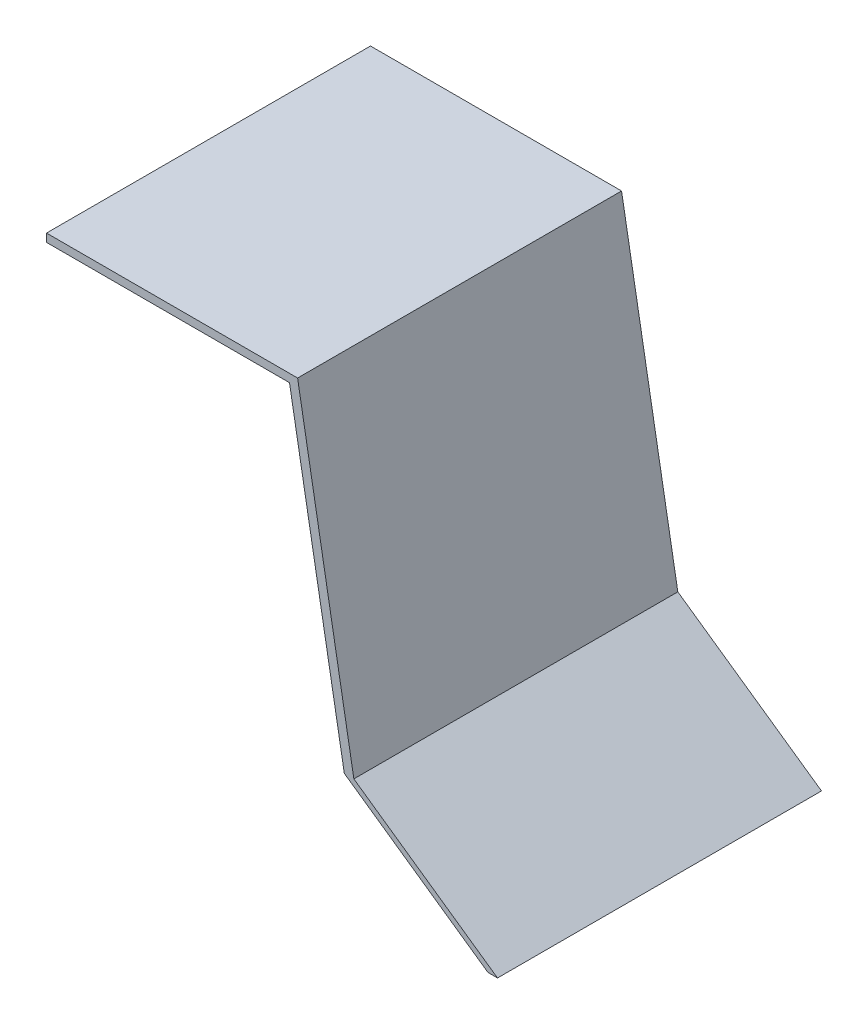
ISO-10303-21;
HEADER;
FILE_DESCRIPTION(('STEP AP214'),'2;1');
FILE_NAME('part.step','',(''),(''),'','','');
FILE_SCHEMA(('AUTOMOTIVE_DESIGN { 1 0 10303 214 1 1 1 1 }'));
ENDSEC;
DATA;
#1=APPLICATION_CONTEXT('core data for automotive mechanical design processes');
#2=APPLICATION_PROTOCOL_DEFINITION('international standard','automotive_design',2000,#1);
#3=PRODUCT_CONTEXT('',#1,'mechanical');
#4=PRODUCT('Part','Part','',(#3));
#5=PRODUCT_RELATED_PRODUCT_CATEGORY('part','',(#4));
#6=PRODUCT_DEFINITION_FORMATION('','',#4);
#7=PRODUCT_DEFINITION_CONTEXT('part definition',#1,'design');
#8=PRODUCT_DEFINITION('design','',#6,#7);
#9=PRODUCT_DEFINITION_SHAPE('','',#8);
#10=(LENGTH_UNIT() NAMED_UNIT(*) SI_UNIT(.MILLI.,.METRE.));
#11=(NAMED_UNIT(*) PLANE_ANGLE_UNIT() SI_UNIT($,.RADIAN.));
#12=(NAMED_UNIT(*) SI_UNIT($,.STERADIAN.) SOLID_ANGLE_UNIT());
#13=UNCERTAINTY_MEASURE_WITH_UNIT(LENGTH_MEASURE(1.E-05),#10,'distance_accuracy_value','');
#14=(GEOMETRIC_REPRESENTATION_CONTEXT(3) GLOBAL_UNCERTAINTY_ASSIGNED_CONTEXT((#13)) GLOBAL_UNIT_ASSIGNED_CONTEXT((#10,
#11,#12)) REPRESENTATION_CONTEXT('',''));
#15=CARTESIAN_POINT('',(0.,0.,0.));
#16=DIRECTION('',(0.,0.,1.));
#17=DIRECTION('',(1.,0.,0.));
#18=AXIS2_PLACEMENT_3D('',#15,#16,#17);
#19=CARTESIAN_POINT('',(0.,0.,0.));
#20=DIRECTION('',(0.,1.,0.));
#21=DIRECTION('',(0.,0.,1.));
#22=AXIS2_PLACEMENT_3D('',#19,#20,#21);
#23=PLANE('',#22);
#24=DIRECTION('',(1.,0.,0.));
#25=VECTOR('',#24,1.);
#26=CARTESIAN_POINT('',(127.,0.,0.));
#27=LINE('',#26,#25);
#28=CARTESIAN_POINT('',(127.,0.,0.));
#29=VERTEX_POINT('',#28);
#30=CARTESIAN_POINT('',(508.,0.,0.));
#31=VERTEX_POINT('',#30);
#32=EDGE_CURVE('E250',#29,#31,#27,.T.);
#33=ORIENTED_EDGE('',*,*,#32,.F.);
#34=DIRECTION('',(0.,0.,-1.));
#35=VECTOR('',#34,1.);
#36=CARTESIAN_POINT('',(127.,0.,0.));
#37=LINE('',#36,#35);
#38=CARTESIAN_POINT('',(127.,0.,-508.));
#39=VERTEX_POINT('',#38);
#40=EDGE_CURVE('E144',#29,#39,#37,.T.);
#41=ORIENTED_EDGE('',*,*,#40,.T.);
#42=DIRECTION('',(1.,0.,0.));
#43=VECTOR('',#42,1.);
#44=CARTESIAN_POINT('',(127.,0.,-508.));
#45=LINE('',#44,#43);
#46=CARTESIAN_POINT('',(508.,0.,-508.));
#47=VERTEX_POINT('',#46);
#48=EDGE_CURVE('E262',#39,#47,#45,.T.);
#49=ORIENTED_EDGE('',*,*,#48,.T.);
#50=DIRECTION('',(0.,0.,-1.));
#51=VECTOR('',#50,1.);
#52=CARTESIAN_POINT('',(508.,0.,0.));
#53=LINE('',#52,#51);
#54=EDGE_CURVE('E258',#31,#47,#53,.T.);
#55=ORIENTED_EDGE('',*,*,#54,.F.);
#56=EDGE_LOOP('',(#33,#41,#49,#55));
#57=FACE_BOUND('',#56,.T.);
#58=DIRECTION('',(-1.,0.,0.));
#59=VECTOR('',#58,1.);
#60=CARTESIAN_POINT('',(330.2,0.,-228.6));
#61=LINE('',#60,#59);
#62=CARTESIAN_POINT('',(330.2,0.,-228.6));
#63=VERTEX_POINT('',#62);
#64=CARTESIAN_POINT('',(304.8,0.,-228.6));
#65=VERTEX_POINT('',#64);
#66=EDGE_CURVE('E59',#63,#65,#61,.T.);
#67=ORIENTED_EDGE('',*,*,#66,.F.);
#68=DIRECTION('',(0.,0.,1.));
#69=VECTOR('',#68,1.);
#70=CARTESIAN_POINT('',(330.2,0.,-228.6));
#71=LINE('',#70,#69);
#72=CARTESIAN_POINT('',(330.2,0.,-279.4));
#73=VERTEX_POINT('',#72);
#74=EDGE_CURVE('E212',#73,#63,#71,.T.);
#75=ORIENTED_EDGE('',*,*,#74,.F.);
#76=DIRECTION('',(-1.,0.,0.));
#77=VECTOR('',#76,1.);
#78=CARTESIAN_POINT('',(330.2,0.,-279.4));
#79=LINE('',#78,#77);
#80=CARTESIAN_POINT('',(304.8,0.,-279.4));
#81=VERTEX_POINT('',#80);
#82=EDGE_CURVE('E227',#73,#81,#79,.T.);
#83=ORIENTED_EDGE('',*,*,#82,.T.);
#84=DIRECTION('',(0.,0.,1.));
#85=VECTOR('',#84,1.);
#86=CARTESIAN_POINT('',(304.8,0.,-228.6));
#87=LINE('',#86,#85);
#88=EDGE_CURVE('E64',#81,#65,#87,.T.);
#89=ORIENTED_EDGE('',*,*,#88,.T.);
#90=EDGE_LOOP('',(#67,#75,#83,#89));
#91=FACE_BOUND('',#90,.T.);
#92=ADVANCED_FACE('F43',(#57,#91),#23,.F.);
#93=CARTESIAN_POINT('',(127.,12.7,0.));
#94=DIRECTION('',(0.,0.,-1.));
#95=DIRECTION('',(-1.,0.,0.));
#96=AXIS2_PLACEMENT_3D('',#93,#94,#95);
#97=PLANE('',#96);
#98=ORIENTED_EDGE('',*,*,#32,.T.);
#99=DIRECTION('',(0.173648177666934,-0.984807753012207,0.));
#100=VECTOR('',#99,1.);
#101=CARTESIAN_POINT('',(593.973921599805,-487.582338530201,0.));
#102=LINE('',#101,#100);
#103=CARTESIAN_POINT('',(593.973921599805,-487.582338530201,0.));
#104=VERTEX_POINT('',#103);
#105=EDGE_CURVE('E176',#31,#104,#102,.T.);
#106=ORIENTED_EDGE('',*,*,#105,.T.);
#107=DIRECTION('',(0.819152044288995,-0.573576436351041,0.));
#108=VECTOR('',#107,1.);
#109=CARTESIAN_POINT('',(819.241419295268,-645.316338530201,0.));
#110=LINE('',#109,#108);
#111=CARTESIAN_POINT('',(819.241419295268,-645.316338530201,0.));
#112=VERTEX_POINT('',#111);
#113=EDGE_CURVE('E172',#104,#112,#110,.T.);
#114=ORIENTED_EDGE('',*,*,#113,.T.);
#115=DIRECTION('',(1.,0.,0.));
#116=VECTOR('',#115,1.);
#117=CARTESIAN_POINT('',(834.180771950266,-645.316338530201,0.));
#118=LINE('',#117,#116);
#119=CARTESIAN_POINT('',(834.180771950266,-645.316338530201,0.));
#120=VERTEX_POINT('',#119);
#121=EDGE_CURVE('E167',#112,#120,#118,.T.);
#122=ORIENTED_EDGE('',*,*,#121,.T.);
#123=DIRECTION('',(-0.819152044288995,0.573576436351041,0.));
#124=VECTOR('',#123,1.);
#125=CARTESIAN_POINT('',(608.913274254802,-487.582338530201,0.));
#126=LINE('',#125,#124);
#127=CARTESIAN_POINT('',(608.913274254802,-487.582338530201,0.));
#128=VERTEX_POINT('',#127);
#129=EDGE_CURVE('E158',#120,#128,#126,.T.);
#130=ORIENTED_EDGE('',*,*,#129,.T.);
#131=DIRECTION('',(-0.173648177666934,0.984807753012208,0.));
#132=VECTOR('',#131,1.);
#133=CARTESIAN_POINT('',(520.7,12.7,0.));
#134=LINE('',#133,#132);
#135=CARTESIAN_POINT('',(520.7,12.7,0.));
#136=VERTEX_POINT('',#135);
#137=EDGE_CURVE('E150',#128,#136,#134,.T.);
#138=ORIENTED_EDGE('',*,*,#137,.T.);
#139=DIRECTION('',(1.,0.,0.));
#140=VECTOR('',#139,1.);
#141=CARTESIAN_POINT('',(127.,12.7,0.));
#142=LINE('',#141,#140);
#143=CARTESIAN_POINT('',(127.,12.7,0.));
#144=VERTEX_POINT('',#143);
#145=EDGE_CURVE('E132',#144,#136,#142,.T.);
#146=ORIENTED_EDGE('',*,*,#145,.F.);
#147=DIRECTION('',(0.,-1.,0.));
#148=VECTOR('',#147,1.);
#149=CARTESIAN_POINT('',(127.,12.7,0.));
#150=LINE('',#149,#148);
#151=EDGE_CURVE('E52',#144,#29,#150,.T.);
#152=ORIENTED_EDGE('',*,*,#151,.T.);
#153=EDGE_LOOP('',(#98,#106,#114,#122,#130,#138,#146,#152));
#154=FACE_BOUND('',#153,.T.);
#155=ADVANCED_FACE('F45',(#154),#97,.F.);
#156=CARTESIAN_POINT('',(127.,12.7,-508.));
#157=DIRECTION('',(0.,0.,-1.));
#158=DIRECTION('',(-1.,0.,0.));
#159=AXIS2_PLACEMENT_3D('',#156,#157,#158);
#160=PLANE('',#159);
#161=ORIENTED_EDGE('',*,*,#48,.F.);
#162=DIRECTION('',(0.,-1.,0.));
#163=VECTOR('',#162,1.);
#164=CARTESIAN_POINT('',(127.,12.7,-508.));
#165=LINE('',#164,#163);
#166=CARTESIAN_POINT('',(127.,12.7,-508.));
#167=VERTEX_POINT('',#166);
#168=EDGE_CURVE('E11',#167,#39,#165,.T.);
#169=ORIENTED_EDGE('',*,*,#168,.F.);
#170=DIRECTION('',(1.,0.,0.));
#171=VECTOR('',#170,1.);
#172=CARTESIAN_POINT('',(127.,12.7,-508.));
#173=LINE('',#172,#171);
#174=CARTESIAN_POINT('',(520.7,12.7,-508.));
#175=VERTEX_POINT('',#174);
#176=EDGE_CURVE('E143',#167,#175,#173,.T.);
#177=ORIENTED_EDGE('',*,*,#176,.T.);
#178=DIRECTION('',(-0.173648177666934,0.984807753012207,0.));
#179=VECTOR('',#178,1.);
#180=CARTESIAN_POINT('',(520.7,12.7,-508.));
#181=LINE('',#180,#179);
#182=CARTESIAN_POINT('',(608.913274254802,-487.582338530201,-508.));
#183=VERTEX_POINT('',#182);
#184=EDGE_CURVE('E151',#183,#175,#181,.T.);
#185=ORIENTED_EDGE('',*,*,#184,.F.);
#186=DIRECTION('',(-0.819152044288995,0.573576436351041,0.));
#187=VECTOR('',#186,1.);
#188=CARTESIAN_POINT('',(608.913274254802,-487.582338530201,-508.));
#189=LINE('',#188,#187);
#190=CARTESIAN_POINT('',(834.180771950266,-645.316338530201,-508.));
#191=VERTEX_POINT('',#190);
#192=EDGE_CURVE('E183',#191,#183,#189,.T.);
#193=ORIENTED_EDGE('',*,*,#192,.F.);
#194=DIRECTION('',(1.,0.,0.));
#195=VECTOR('',#194,1.);
#196=CARTESIAN_POINT('',(834.180771950266,-645.316338530201,-508.));
#197=LINE('',#196,#195);
#198=CARTESIAN_POINT('',(819.241419295268,-645.316338530201,-508.));
#199=VERTEX_POINT('',#198);
#200=EDGE_CURVE('E188',#199,#191,#197,.T.);
#201=ORIENTED_EDGE('',*,*,#200,.F.);
#202=DIRECTION('',(0.819152044288995,-0.573576436351041,0.));
#203=VECTOR('',#202,1.);
#204=CARTESIAN_POINT('',(819.241419295268,-645.316338530201,-508.));
#205=LINE('',#204,#203);
#206=CARTESIAN_POINT('',(593.973921599805,-487.582338530201,-508.));
#207=VERTEX_POINT('',#206);
#208=EDGE_CURVE('E193',#207,#199,#205,.T.);
#209=ORIENTED_EDGE('',*,*,#208,.F.);
#210=DIRECTION('',(0.173648177666934,-0.984807753012208,0.));
#211=VECTOR('',#210,1.);
#212=CARTESIAN_POINT('',(593.973921599805,-487.582338530201,-508.));
#213=LINE('',#212,#211);
#214=EDGE_CURVE('E160',#47,#207,#213,.T.);
#215=ORIENTED_EDGE('',*,*,#214,.F.);
#216=EDGE_LOOP('',(#161,#169,#177,#185,#193,#201,#209,#215));
#217=FACE_BOUND('',#216,.T.);
#218=ADVANCED_FACE('F278',(#217),#160,.T.);
#219=CARTESIAN_POINT('',(127.,12.7,0.));
#220=DIRECTION('',(-1.,0.,0.));
#221=DIRECTION('',(0.,0.,1.));
#222=AXIS2_PLACEMENT_3D('',#219,#220,#221);
#223=PLANE('',#222);
#224=ORIENTED_EDGE('',*,*,#40,.F.);
#225=ORIENTED_EDGE('',*,*,#151,.F.);
#226=DIRECTION('',(0.,0.,-1.));
#227=VECTOR('',#226,1.);
#228=CARTESIAN_POINT('',(127.,12.7,0.));
#229=LINE('',#228,#227);
#230=EDGE_CURVE('E139',#144,#167,#229,.T.);
#231=ORIENTED_EDGE('',*,*,#230,.T.);
#232=ORIENTED_EDGE('',*,*,#168,.T.);
#233=EDGE_LOOP('',(#224,#225,#231,#232));
#234=FACE_BOUND('',#233,.T.);
#235=ADVANCED_FACE('F274',(#234),#223,.T.);
#236=CARTESIAN_POINT('',(0.,12.7,0.));
#237=DIRECTION('',(0.,1.,0.));
#238=DIRECTION('',(0.,0.,1.));
#239=AXIS2_PLACEMENT_3D('',#236,#237,#238);
#240=PLANE('',#239);
#241=ORIENTED_EDGE('',*,*,#145,.T.);
#242=DIRECTION('',(0.,0.,1.));
#243=VECTOR('',#242,1.);
#244=CARTESIAN_POINT('',(520.7,12.7,-1242.42453510403));
#245=LINE('',#244,#243);
#246=EDGE_CURVE('E136',#175,#136,#245,.T.);
#247=ORIENTED_EDGE('',*,*,#246,.F.);
#248=ORIENTED_EDGE('',*,*,#176,.F.);
#249=ORIENTED_EDGE('',*,*,#230,.F.);
#250=EDGE_LOOP('',(#241,#247,#248,#249));
#251=FACE_BOUND('',#250,.T.);
#252=ADVANCED_FACE('F134',(#251),#240,.T.);
#253=CARTESIAN_POINT('',(330.2,-63.5,-254.));
#254=DIRECTION('',(1.,0.,0.));
#255=DIRECTION('',(0.,0.,-1.));
#256=AXIS2_PLACEMENT_3D('',#253,#254,#255);
#257=PLANE('',#256);
#258=ORIENTED_EDGE('',*,*,#74,.T.);
#259=DIRECTION('',(0.,-1.,0.));
#260=VECTOR('',#259,1.);
#261=CARTESIAN_POINT('',(330.2,0.,-228.6));
#262=LINE('',#261,#260);
#263=CARTESIAN_POINT('',(330.2,-63.5,-228.6));
#264=VERTEX_POINT('',#263);
#265=EDGE_CURVE('E216',#63,#264,#262,.T.);
#266=ORIENTED_EDGE('',*,*,#265,.T.);
#267=CARTESIAN_POINT('',(330.2,-63.5,-254.));
#268=DIRECTION('',(1.,0.,0.));
#269=DIRECTION('',(0.,0.,-1.));
#270=AXIS2_PLACEMENT_3D('',#267,#268,#269);
#271=CIRCLE('',#270,25.4);
#272=CARTESIAN_POINT('',(330.2,-63.5,-279.4));
#273=VERTEX_POINT('',#272);
#274=EDGE_CURVE('E220',#264,#273,#271,.T.);
#275=ORIENTED_EDGE('',*,*,#274,.T.);
#276=DIRECTION('',(0.,1.,0.));
#277=VECTOR('',#276,1.);
#278=CARTESIAN_POINT('',(330.2,0.,-279.4));
#279=LINE('',#278,#277);
#280=EDGE_CURVE('E223',#273,#73,#279,.T.);
#281=ORIENTED_EDGE('',*,*,#280,.T.);
#282=EDGE_LOOP('',(#258,#266,#275,#281));
#283=FACE_BOUND('',#282,.T.);
#284=CARTESIAN_POINT('',(330.2,-63.5,-254.));
#285=DIRECTION('',(1.,0.,0.));
#286=DIRECTION('',(0.,0.,-1.));
#287=AXIS2_PLACEMENT_3D('',#284,#285,#286);
#288=CIRCLE('',#287,6.35);
#289=CARTESIAN_POINT('',(330.2,-63.5,-260.35));
#290=VERTEX_POINT('',#289);
#291=EDGE_CURVE('E205',#290,#290,#288,.T.);
#292=ORIENTED_EDGE('',*,*,#291,.F.);
#293=EDGE_LOOP('',(#292));
#294=FACE_BOUND('',#293,.T.);
#295=ADVANCED_FACE('F325',(#283,#294),#257,.T.);
#296=CARTESIAN_POINT('',(304.8,-63.5,-254.));
#297=DIRECTION('',(1.,0.,0.));
#298=DIRECTION('',(0.,0.,-1.));
#299=AXIS2_PLACEMENT_3D('',#296,#297,#298);
#300=PLANE('',#299);
#301=ORIENTED_EDGE('',*,*,#88,.F.);
#302=DIRECTION('',(0.,1.,0.));
#303=VECTOR('',#302,1.);
#304=CARTESIAN_POINT('',(304.8,0.,-279.4));
#305=LINE('',#304,#303);
#306=CARTESIAN_POINT('',(304.8,-63.5,-279.4));
#307=VERTEX_POINT('',#306);
#308=EDGE_CURVE('E217',#307,#81,#305,.T.);
#309=ORIENTED_EDGE('',*,*,#308,.F.);
#310=CARTESIAN_POINT('',(304.8,-63.5,-254.));
#311=DIRECTION('',(1.,0.,0.));
#312=DIRECTION('',(0.,0.,-1.));
#313=AXIS2_PLACEMENT_3D('',#310,#311,#312);
#314=CIRCLE('',#313,25.4);
#315=CARTESIAN_POINT('',(304.8,-63.5,-228.6));
#316=VERTEX_POINT('',#315);
#317=EDGE_CURVE('E233',#316,#307,#314,.T.);
#318=ORIENTED_EDGE('',*,*,#317,.F.);
#319=DIRECTION('',(0.,-1.,0.));
#320=VECTOR('',#319,1.);
#321=CARTESIAN_POINT('',(304.8,0.,-228.6));
#322=LINE('',#321,#320);
#323=EDGE_CURVE('E230',#65,#316,#322,.T.);
#324=ORIENTED_EDGE('',*,*,#323,.F.);
#325=EDGE_LOOP('',(#301,#309,#318,#324));
#326=FACE_BOUND('',#325,.T.);
#327=CARTESIAN_POINT('',(304.8,-63.5,-254.));
#328=DIRECTION('',(1.,0.,0.));
#329=DIRECTION('',(0.,0.,-1.));
#330=AXIS2_PLACEMENT_3D('',#327,#328,#329);
#331=CIRCLE('',#330,6.35);
#332=CARTESIAN_POINT('',(304.8,-63.5,-260.35));
#333=VERTEX_POINT('',#332);
#334=EDGE_CURVE('E153',#333,#333,#331,.T.);
#335=ORIENTED_EDGE('',*,*,#334,.T.);
#336=EDGE_LOOP('',(#335));
#337=FACE_BOUND('',#336,.T.);
#338=ADVANCED_FACE('F331',(#326,#337),#300,.F.);
#339=CARTESIAN_POINT('',(330.2,0.,-228.6));
#340=DIRECTION('',(0.,0.,-1.));
#341=DIRECTION('',(0.,1.,0.));
#342=AXIS2_PLACEMENT_3D('',#339,#340,#341);
#343=PLANE('',#342);
#344=ORIENTED_EDGE('',*,*,#323,.T.);
#345=DIRECTION('',(-1.,0.,0.));
#346=VECTOR('',#345,1.);
#347=CARTESIAN_POINT('',(330.2,-63.5,-228.6));
#348=LINE('',#347,#346);
#349=EDGE_CURVE('E245',#264,#316,#348,.T.);
#350=ORIENTED_EDGE('',*,*,#349,.F.);
#351=ORIENTED_EDGE('',*,*,#265,.F.);
#352=ORIENTED_EDGE('',*,*,#66,.T.);
#353=EDGE_LOOP('',(#344,#350,#351,#352));
#354=FACE_BOUND('',#353,.T.);
#355=ADVANCED_FACE('F339',(#354),#343,.F.);
#356=CARTESIAN_POINT('',(330.2,-63.5,-254.));
#357=DIRECTION('',(-1.,0.,0.));
#358=DIRECTION('',(0.,0.,1.));
#359=AXIS2_PLACEMENT_3D('',#356,#357,#358);
#360=CYLINDRICAL_SURFACE('',#359,25.4);
#361=ORIENTED_EDGE('',*,*,#317,.T.);
#362=DIRECTION('',(-1.,0.,0.));
#363=VECTOR('',#362,1.);
#364=CARTESIAN_POINT('',(330.2,-63.5,-279.4));
#365=LINE('',#364,#363);
#366=EDGE_CURVE('E241',#273,#307,#365,.T.);
#367=ORIENTED_EDGE('',*,*,#366,.F.);
#368=ORIENTED_EDGE('',*,*,#274,.F.);
#369=ORIENTED_EDGE('',*,*,#349,.T.);
#370=EDGE_LOOP('',(#361,#367,#368,#369));
#371=FACE_BOUND('',#370,.T.);
#372=ADVANCED_FACE('F347',(#371),#360,.T.);
#373=CARTESIAN_POINT('',(330.2,0.,-279.4));
#374=DIRECTION('',(0.,0.,1.));
#375=DIRECTION('',(0.,-1.,0.));
#376=AXIS2_PLACEMENT_3D('',#373,#374,#375);
#377=PLANE('',#376);
#378=ORIENTED_EDGE('',*,*,#308,.T.);
#379=ORIENTED_EDGE('',*,*,#82,.F.);
#380=ORIENTED_EDGE('',*,*,#280,.F.);
#381=ORIENTED_EDGE('',*,*,#366,.T.);
#382=EDGE_LOOP('',(#378,#379,#380,#381));
#383=FACE_BOUND('',#382,.T.);
#384=ADVANCED_FACE('F354',(#383),#377,.F.);
#385=CARTESIAN_POINT('',(330.2,-63.5,-254.));
#386=DIRECTION('',(-1.,0.,0.));
#387=DIRECTION('',(0.,0.,1.));
#388=AXIS2_PLACEMENT_3D('',#385,#386,#387);
#389=CYLINDRICAL_SURFACE('',#388,6.35);
#390=ORIENTED_EDGE('',*,*,#291,.T.);
#391=EDGE_LOOP('',(#390));
#392=FACE_BOUND('',#391,.T.);
#393=ORIENTED_EDGE('',*,*,#334,.F.);
#394=EDGE_LOOP('',(#393));
#395=FACE_BOUND('',#394,.T.);
#396=ADVANCED_FACE('F362',(#392,#395),#389,.F.);
#397=CARTESIAN_POINT('',(593.973921599805,-487.582338530201,-1242.42453510403));
#398=DIRECTION('',(-0.984807753012208,-0.173648177666934,0.));
#399=DIRECTION('',(0.173648177666934,-0.984807753012208,0.));
#400=AXIS2_PLACEMENT_3D('',#397,#398,#399);
#401=PLANE('',#400);
#402=ORIENTED_EDGE('',*,*,#54,.T.);
#403=ORIENTED_EDGE('',*,*,#214,.T.);
#404=DIRECTION('',(0.,0.,1.));
#405=VECTOR('',#404,1.);
#406=CARTESIAN_POINT('',(593.973921599805,-487.582338530201,-1242.42453510403));
#407=LINE('',#406,#405);
#408=EDGE_CURVE('E165',#207,#104,#407,.T.);
#409=ORIENTED_EDGE('',*,*,#408,.T.);
#410=ORIENTED_EDGE('',*,*,#105,.F.);
#411=EDGE_LOOP('',(#402,#403,#409,#410));
#412=FACE_BOUND('',#411,.T.);
#413=ADVANCED_FACE('F281',(#412),#401,.T.);
#414=CARTESIAN_POINT('',(819.241419295268,-645.316338530201,-1242.42453510403));
#415=DIRECTION('',(-0.573576436351041,-0.819152044288995,0.));
#416=DIRECTION('',(0.819152044288995,-0.573576436351041,0.));
#417=AXIS2_PLACEMENT_3D('',#414,#415,#416);
#418=PLANE('',#417);
#419=ORIENTED_EDGE('',*,*,#408,.F.);
#420=ORIENTED_EDGE('',*,*,#208,.T.);
#421=DIRECTION('',(0.,0.,1.));
#422=VECTOR('',#421,1.);
#423=CARTESIAN_POINT('',(819.241419295268,-645.316338530201,-1242.42453510403));
#424=LINE('',#423,#422);
#425=EDGE_CURVE('E192',#199,#112,#424,.T.);
#426=ORIENTED_EDGE('',*,*,#425,.T.);
#427=ORIENTED_EDGE('',*,*,#113,.F.);
#428=EDGE_LOOP('',(#419,#420,#426,#427));
#429=FACE_BOUND('',#428,.T.);
#430=ADVANCED_FACE('F285',(#429),#418,.T.);
#431=CARTESIAN_POINT('',(834.180771950266,-645.316338530201,-1242.42453510403));
#432=DIRECTION('',(0.,-1.,0.));
#433=DIRECTION('',(0.,0.,-1.));
#434=AXIS2_PLACEMENT_3D('',#431,#432,#433);
#435=PLANE('',#434);
#436=ORIENTED_EDGE('',*,*,#425,.F.);
#437=ORIENTED_EDGE('',*,*,#200,.T.);
#438=DIRECTION('',(0.,0.,1.));
#439=VECTOR('',#438,1.);
#440=CARTESIAN_POINT('',(834.180771950266,-645.316338530201,-1242.42453510403));
#441=LINE('',#440,#439);
#442=EDGE_CURVE('E187',#191,#120,#441,.T.);
#443=ORIENTED_EDGE('',*,*,#442,.T.);
#444=ORIENTED_EDGE('',*,*,#121,.F.);
#445=EDGE_LOOP('',(#436,#437,#443,#444));
#446=FACE_BOUND('',#445,.T.);
#447=ADVANCED_FACE('F288',(#446),#435,.T.);
#448=CARTESIAN_POINT('',(608.913274254802,-487.582338530201,-1242.42453510403));
#449=DIRECTION('',(0.573576436351041,0.819152044288995,0.));
#450=DIRECTION('',(-0.819152044288995,0.573576436351041,0.));
#451=AXIS2_PLACEMENT_3D('',#448,#449,#450);
#452=PLANE('',#451);
#453=ORIENTED_EDGE('',*,*,#442,.F.);
#454=ORIENTED_EDGE('',*,*,#192,.T.);
#455=DIRECTION('',(0.,0.,1.));
#456=VECTOR('',#455,1.);
#457=CARTESIAN_POINT('',(608.913274254802,-487.582338530201,-1242.42453510403));
#458=LINE('',#457,#456);
#459=EDGE_CURVE('E182',#183,#128,#458,.T.);
#460=ORIENTED_EDGE('',*,*,#459,.T.);
#461=ORIENTED_EDGE('',*,*,#129,.F.);
#462=EDGE_LOOP('',(#453,#454,#460,#461));
#463=FACE_BOUND('',#462,.T.);
#464=ADVANCED_FACE('F291',(#463),#452,.T.);
#465=CARTESIAN_POINT('',(520.7,12.7,-1242.42453510403));
#466=DIRECTION('',(0.984807753012207,0.173648177666934,0.));
#467=DIRECTION('',(-0.173648177666934,0.984807753012207,0.));
#468=AXIS2_PLACEMENT_3D('',#465,#466,#467);
#469=PLANE('',#468);
#470=ORIENTED_EDGE('',*,*,#459,.F.);
#471=ORIENTED_EDGE('',*,*,#184,.T.);
#472=ORIENTED_EDGE('',*,*,#246,.T.);
#473=ORIENTED_EDGE('',*,*,#137,.F.);
#474=EDGE_LOOP('',(#470,#471,#472,#473));
#475=FACE_BOUND('',#474,.T.);
#476=ADVANCED_FACE('F149',(#475),#469,.T.);
#477=CLOSED_SHELL('',(#92,#155,#218,#235,#252,#295,#338,#355,#372,#384,#396,#413,#430,#447,#464,#476));
#478=MANIFOLD_SOLID_BREP('B2',#477);
#479=ADVANCED_BREP_SHAPE_REPRESENTATION('',(#18,#478),#14);
#480=SHAPE_DEFINITION_REPRESENTATION(#9,#479);
ENDSEC;
END-ISO-10303-21;
